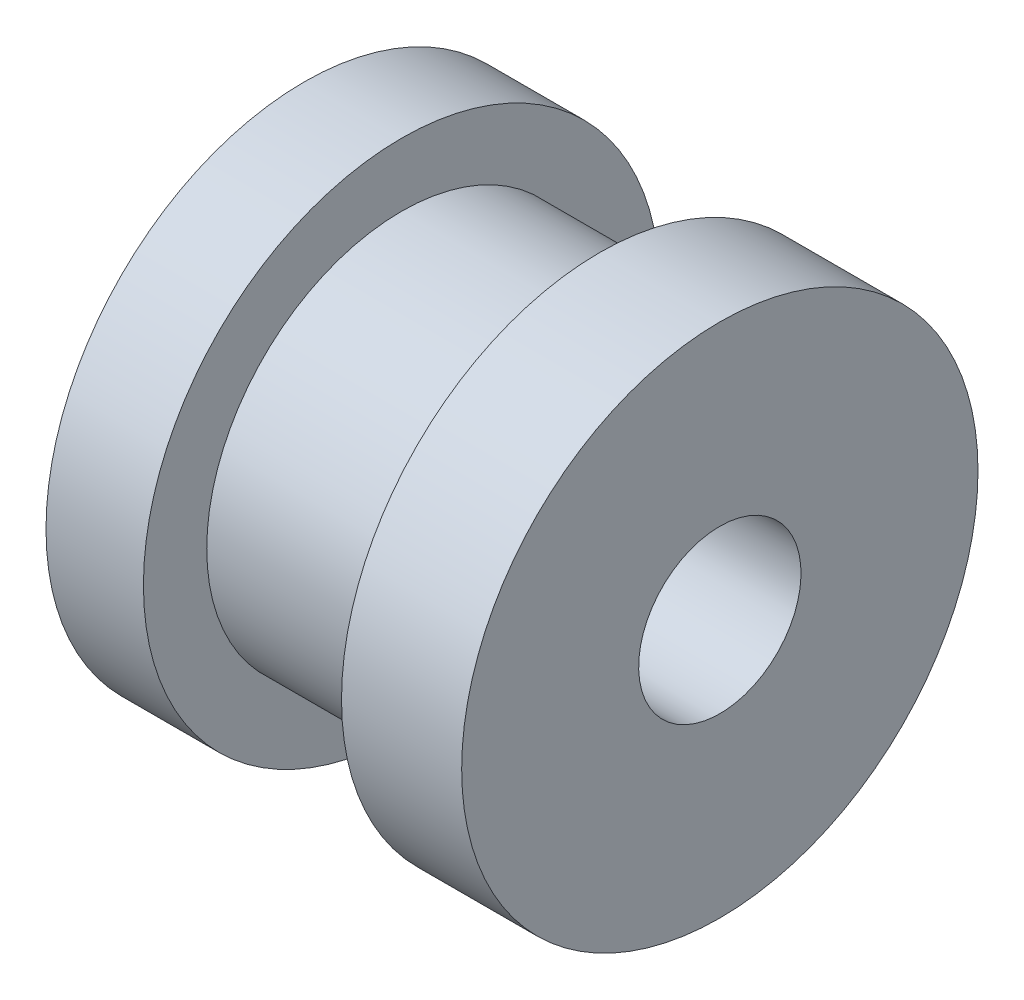
ISO-10303-21;
HEADER;
FILE_DESCRIPTION(('STEP AP214'),'2;1');
FILE_NAME('part.step','',(''),(''),'','','');
FILE_SCHEMA(('AUTOMOTIVE_DESIGN { 1 0 10303 214 1 1 1 1 }'));
ENDSEC;
DATA;
#1=APPLICATION_CONTEXT('core data for automotive mechanical design processes');
#2=APPLICATION_PROTOCOL_DEFINITION('international standard','automotive_design',2000,#1);
#3=PRODUCT_CONTEXT('',#1,'mechanical');
#4=PRODUCT('Part','Part','',(#3));
#5=PRODUCT_RELATED_PRODUCT_CATEGORY('part','',(#4));
#6=PRODUCT_DEFINITION_FORMATION('','',#4);
#7=PRODUCT_DEFINITION_CONTEXT('part definition',#1,'design');
#8=PRODUCT_DEFINITION('design','',#6,#7);
#9=PRODUCT_DEFINITION_SHAPE('','',#8);
#10=(LENGTH_UNIT() NAMED_UNIT(*) SI_UNIT(.MILLI.,.METRE.));
#11=(NAMED_UNIT(*) PLANE_ANGLE_UNIT() SI_UNIT($,.RADIAN.));
#12=(NAMED_UNIT(*) SI_UNIT($,.STERADIAN.) SOLID_ANGLE_UNIT());
#13=UNCERTAINTY_MEASURE_WITH_UNIT(LENGTH_MEASURE(1.E-05),#10,'distance_accuracy_value','');
#14=(GEOMETRIC_REPRESENTATION_CONTEXT(3) GLOBAL_UNCERTAINTY_ASSIGNED_CONTEXT((#13)) GLOBAL_UNIT_ASSIGNED_CONTEXT((#10,
#11,#12)) REPRESENTATION_CONTEXT('',''));
#15=CARTESIAN_POINT('',(0.,0.,0.));
#16=DIRECTION('',(0.,0.,1.));
#17=DIRECTION('',(1.,0.,0.));
#18=AXIS2_PLACEMENT_3D('',#15,#16,#17);
#19=CARTESIAN_POINT('',(0.,0.,0.));
#20=DIRECTION('',(1.,0.,0.));
#21=DIRECTION('',(0.,1.,0.));
#22=AXIS2_PLACEMENT_3D('',#19,#20,#21);
#23=CYLINDRICAL_SURFACE('',#22,7.95);
#24=CARTESIAN_POINT('',(-3.7,0.,0.));
#25=DIRECTION('',(1.,0.,0.));
#26=DIRECTION('',(0.,1.,0.));
#27=AXIS2_PLACEMENT_3D('',#24,#25,#26);
#28=CIRCLE('',#27,7.95);
#29=CARTESIAN_POINT('',(-3.7,7.95,0.));
#30=VERTEX_POINT('',#29);
#31=EDGE_CURVE('E61',#30,#30,#28,.T.);
#32=ORIENTED_EDGE('',*,*,#31,.T.);
#33=EDGE_LOOP('',(#32));
#34=FACE_BOUND('',#33,.T.);
#35=CARTESIAN_POINT('',(0.,0.,0.));
#36=DIRECTION('',(1.,0.,0.));
#37=DIRECTION('',(0.,1.,0.));
#38=AXIS2_PLACEMENT_3D('',#35,#36,#37);
#39=CIRCLE('',#38,7.95);
#40=CARTESIAN_POINT('',(0.,7.95,0.));
#41=VERTEX_POINT('',#40);
#42=EDGE_CURVE('E10',#41,#41,#39,.T.);
#43=ORIENTED_EDGE('',*,*,#42,.F.);
#44=EDGE_LOOP('',(#43));
#45=FACE_BOUND('',#44,.T.);
#46=ADVANCED_FACE('F36',(#34,#45),#23,.T.);
#47=CARTESIAN_POINT('',(0.,7.95,0.));
#48=DIRECTION('',(1.,0.,0.));
#49=DIRECTION('',(0.,1.,0.));
#50=AXIS2_PLACEMENT_3D('',#47,#48,#49);
#51=PLANE('',#50);
#52=ORIENTED_EDGE('',*,*,#42,.T.);
#53=EDGE_LOOP('',(#52));
#54=FACE_BOUND('',#53,.T.);
#55=CARTESIAN_POINT('',(0.,0.,0.));
#56=DIRECTION('',(1.,0.,0.));
#57=DIRECTION('',(0.,1.,0.));
#58=AXIS2_PLACEMENT_3D('',#55,#56,#57);
#59=CIRCLE('',#58,2.5);
#60=CARTESIAN_POINT('',(0.,2.5,0.));
#61=VERTEX_POINT('',#60);
#62=EDGE_CURVE('E43',#61,#61,#59,.T.);
#63=ORIENTED_EDGE('',*,*,#62,.F.);
#64=EDGE_LOOP('',(#63));
#65=FACE_BOUND('',#64,.T.);
#66=ADVANCED_FACE('F110',(#54,#65),#51,.T.);
#67=CARTESIAN_POINT('',(0.,0.,0.));
#68=DIRECTION('',(1.,0.,0.));
#69=DIRECTION('',(0.,1.,0.));
#70=AXIS2_PLACEMENT_3D('',#67,#68,#69);
#71=CYLINDRICAL_SURFACE('',#70,2.5);
#72=CARTESIAN_POINT('',(-3.8,0.,0.));
#73=DIRECTION('',(1.,0.,0.));
#74=DIRECTION('',(0.,0.,-1.));
#75=AXIS2_PLACEMENT_3D('',#72,#73,#74);
#76=CIRCLE('',#75,2.5);
#77=CARTESIAN_POINT('',(-3.8,0.,-2.5));
#78=VERTEX_POINT('',#77);
#79=EDGE_CURVE('E39',#78,#78,#76,.T.);
#80=ORIENTED_EDGE('',*,*,#79,.F.);
#81=EDGE_LOOP('',(#80));
#82=FACE_BOUND('',#81,.T.);
#83=ORIENTED_EDGE('',*,*,#62,.T.);
#84=EDGE_LOOP('',(#83));
#85=FACE_BOUND('',#84,.T.);
#86=ADVANCED_FACE('F80',(#82,#85),#71,.F.);
#87=CARTESIAN_POINT('',(-12.8,2.5,0.));
#88=DIRECTION('',(-1.,0.,0.));
#89=DIRECTION('',(0.,-1.,0.));
#90=AXIS2_PLACEMENT_3D('',#87,#88,#89);
#91=PLANE('',#90);
#92=CARTESIAN_POINT('',(-12.8,0.,0.));
#93=DIRECTION('',(-1.,0.,0.));
#94=DIRECTION('',(0.,0.,1.));
#95=AXIS2_PLACEMENT_3D('',#92,#93,#94);
#96=CIRCLE('',#95,5.65);
#97=CARTESIAN_POINT('',(-12.8,0.,5.65));
#98=VERTEX_POINT('',#97);
#99=EDGE_CURVE('E70',#98,#98,#96,.T.);
#100=ORIENTED_EDGE('',*,*,#99,.F.);
#101=EDGE_LOOP('',(#100));
#102=FACE_BOUND('',#101,.T.);
#103=CARTESIAN_POINT('',(-12.8,0.,0.));
#104=DIRECTION('',(1.,0.,0.));
#105=DIRECTION('',(0.,1.,0.));
#106=AXIS2_PLACEMENT_3D('',#103,#104,#105);
#107=CIRCLE('',#106,7.95);
#108=CARTESIAN_POINT('',(-12.8,7.95,0.));
#109=VERTEX_POINT('',#108);
#110=EDGE_CURVE('E47',#109,#109,#107,.T.);
#111=ORIENTED_EDGE('',*,*,#110,.F.);
#112=EDGE_LOOP('',(#111));
#113=FACE_BOUND('',#112,.T.);
#114=ADVANCED_FACE('F76',(#102,#113),#91,.T.);
#115=CARTESIAN_POINT('',(0.,0.,0.));
#116=DIRECTION('',(1.,0.,0.));
#117=DIRECTION('',(0.,1.,0.));
#118=AXIS2_PLACEMENT_3D('',#115,#116,#117);
#119=CYLINDRICAL_SURFACE('',#118,7.95);
#120=ORIENTED_EDGE('',*,*,#110,.T.);
#121=EDGE_LOOP('',(#120));
#122=FACE_BOUND('',#121,.T.);
#123=CARTESIAN_POINT('',(-9.8,0.,0.));
#124=DIRECTION('',(1.,0.,0.));
#125=DIRECTION('',(0.,1.,0.));
#126=AXIS2_PLACEMENT_3D('',#123,#124,#125);
#127=CIRCLE('',#126,7.95);
#128=CARTESIAN_POINT('',(-9.8,7.95,0.));
#129=VERTEX_POINT('',#128);
#130=EDGE_CURVE('E52',#129,#129,#127,.T.);
#131=ORIENTED_EDGE('',*,*,#130,.F.);
#132=EDGE_LOOP('',(#131));
#133=FACE_BOUND('',#132,.T.);
#134=ADVANCED_FACE('F79',(#122,#133),#119,.T.);
#135=CARTESIAN_POINT('',(-9.8,7.95,0.));
#136=DIRECTION('',(1.,0.,0.));
#137=DIRECTION('',(0.,1.,0.));
#138=AXIS2_PLACEMENT_3D('',#135,#136,#137);
#139=PLANE('',#138);
#140=ORIENTED_EDGE('',*,*,#130,.T.);
#141=EDGE_LOOP('',(#140));
#142=FACE_BOUND('',#141,.T.);
#143=CARTESIAN_POINT('',(-9.8,0.,0.));
#144=DIRECTION('',(1.,0.,0.));
#145=DIRECTION('',(0.,1.,0.));
#146=AXIS2_PLACEMENT_3D('',#143,#144,#145);
#147=CIRCLE('',#146,6.);
#148=CARTESIAN_POINT('',(-9.8,6.,0.));
#149=VERTEX_POINT('',#148);
#150=EDGE_CURVE('E55',#149,#149,#147,.T.);
#151=ORIENTED_EDGE('',*,*,#150,.F.);
#152=EDGE_LOOP('',(#151));
#153=FACE_BOUND('',#152,.T.);
#154=ADVANCED_FACE('F86',(#142,#153),#139,.T.);
#155=CARTESIAN_POINT('',(0.,0.,0.));
#156=DIRECTION('',(1.,0.,0.));
#157=DIRECTION('',(0.,1.,0.));
#158=AXIS2_PLACEMENT_3D('',#155,#156,#157);
#159=CYLINDRICAL_SURFACE('',#158,6.);
#160=ORIENTED_EDGE('',*,*,#150,.T.);
#161=EDGE_LOOP('',(#160));
#162=FACE_BOUND('',#161,.T.);
#163=CARTESIAN_POINT('',(-3.7,0.,0.));
#164=DIRECTION('',(1.,0.,0.));
#165=DIRECTION('',(0.,1.,0.));
#166=AXIS2_PLACEMENT_3D('',#163,#164,#165);
#167=CIRCLE('',#166,6.);
#168=CARTESIAN_POINT('',(-3.7,6.,0.));
#169=VERTEX_POINT('',#168);
#170=EDGE_CURVE('E58',#169,#169,#167,.T.);
#171=ORIENTED_EDGE('',*,*,#170,.F.);
#172=EDGE_LOOP('',(#171));
#173=FACE_BOUND('',#172,.T.);
#174=ADVANCED_FACE('F92',(#162,#173),#159,.T.);
#175=CARTESIAN_POINT('',(-3.7,6.,0.));
#176=DIRECTION('',(-1.,0.,0.));
#177=DIRECTION('',(0.,-1.,0.));
#178=AXIS2_PLACEMENT_3D('',#175,#176,#177);
#179=PLANE('',#178);
#180=ORIENTED_EDGE('',*,*,#170,.T.);
#181=EDGE_LOOP('',(#180));
#182=FACE_BOUND('',#181,.T.);
#183=ORIENTED_EDGE('',*,*,#31,.F.);
#184=EDGE_LOOP('',(#183));
#185=FACE_BOUND('',#184,.T.);
#186=ADVANCED_FACE('F98',(#182,#185),#179,.T.);
#187=CARTESIAN_POINT('',(-3.8,0.,0.));
#188=DIRECTION('',(1.,0.,0.));
#189=DIRECTION('',(0.,0.,-1.));
#190=AXIS2_PLACEMENT_3D('',#187,#188,#189);
#191=PLANE('',#190);
#192=ORIENTED_EDGE('',*,*,#79,.T.);
#193=EDGE_LOOP('',(#192));
#194=FACE_BOUND('',#193,.T.);
#195=CARTESIAN_POINT('',(-3.8,0.,0.));
#196=DIRECTION('',(-1.,0.,0.));
#197=DIRECTION('',(0.,0.,1.));
#198=AXIS2_PLACEMENT_3D('',#195,#196,#197);
#199=CIRCLE('',#198,4.4);
#200=CARTESIAN_POINT('',(-3.8,0.,4.4));
#201=VERTEX_POINT('',#200);
#202=EDGE_CURVE('E64',#201,#201,#199,.T.);
#203=ORIENTED_EDGE('',*,*,#202,.T.);
#204=EDGE_LOOP('',(#203));
#205=FACE_BOUND('',#204,.T.);
#206=ADVANCED_FACE('F104',(#194,#205),#191,.F.);
#207=CARTESIAN_POINT('',(-12.8,0.,0.));
#208=DIRECTION('',(-1.,0.,0.));
#209=DIRECTION('',(0.,0.,1.));
#210=AXIS2_PLACEMENT_3D('',#207,#208,#209);
#211=CYLINDRICAL_SURFACE('',#210,4.4);
#212=ORIENTED_EDGE('',*,*,#202,.F.);
#213=EDGE_LOOP('',(#212));
#214=FACE_BOUND('',#213,.T.);
#215=CARTESIAN_POINT('',(-11.55,0.,0.));
#216=DIRECTION('',(-1.,0.,0.));
#217=DIRECTION('',(0.,0.,1.));
#218=AXIS2_PLACEMENT_3D('',#215,#216,#217);
#219=CIRCLE('',#218,4.4);
#220=CARTESIAN_POINT('',(-11.55,0.,4.4));
#221=VERTEX_POINT('',#220);
#222=EDGE_CURVE('E67',#221,#221,#219,.T.);
#223=ORIENTED_EDGE('',*,*,#222,.T.);
#224=EDGE_LOOP('',(#223));
#225=FACE_BOUND('',#224,.T.);
#226=ADVANCED_FACE('F123',(#214,#225),#211,.F.);
#227=CARTESIAN_POINT('',(-12.8,0.,0.));
#228=DIRECTION('',(-1.,0.,0.));
#229=DIRECTION('',(0.,0.,1.));
#230=AXIS2_PLACEMENT_3D('',#227,#228,#229);
#231=CONICAL_SURFACE('',#230,5.65,0.785398163397449);
#232=ORIENTED_EDGE('',*,*,#222,.F.);
#233=EDGE_LOOP('',(#232));
#234=FACE_BOUND('',#233,.T.);
#235=ORIENTED_EDGE('',*,*,#99,.T.);
#236=EDGE_LOOP('',(#235));
#237=FACE_BOUND('',#236,.T.);
#238=ADVANCED_FACE('F74',(#234,#237),#231,.F.);
#239=CLOSED_SHELL('',(#46,#66,#86,#114,#134,#154,#174,#186,#206,#226,#238));
#240=MANIFOLD_SOLID_BREP('B2',#239);
#241=ADVANCED_BREP_SHAPE_REPRESENTATION('',(#18,#240),#14);
#242=SHAPE_DEFINITION_REPRESENTATION(#9,#241);
ENDSEC;
END-ISO-10303-21;
